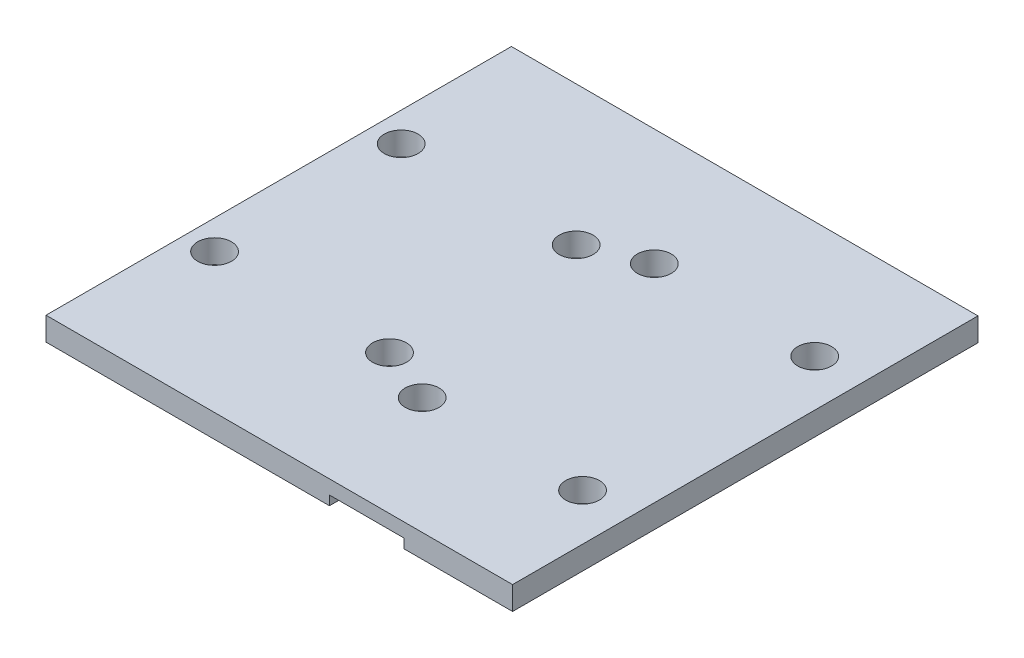
ISO-10303-21;
HEADER;
FILE_DESCRIPTION(('STEP AP214'),'2;1');
FILE_NAME('part.step','',(''),(''),'','','');
FILE_SCHEMA(('AUTOMOTIVE_DESIGN { 1 0 10303 214 1 1 1 1 }'));
ENDSEC;
DATA;
#1=APPLICATION_CONTEXT('core data for automotive mechanical design processes');
#2=APPLICATION_PROTOCOL_DEFINITION('international standard','automotive_design',2000,#1);
#3=PRODUCT_CONTEXT('',#1,'mechanical');
#4=PRODUCT('Part','Part','',(#3));
#5=PRODUCT_RELATED_PRODUCT_CATEGORY('part','',(#4));
#6=PRODUCT_DEFINITION_FORMATION('','',#4);
#7=PRODUCT_DEFINITION_CONTEXT('part definition',#1,'design');
#8=PRODUCT_DEFINITION('design','',#6,#7);
#9=PRODUCT_DEFINITION_SHAPE('','',#8);
#10=(LENGTH_UNIT() NAMED_UNIT(*) SI_UNIT(.MILLI.,.METRE.));
#11=(NAMED_UNIT(*) PLANE_ANGLE_UNIT() SI_UNIT($,.RADIAN.));
#12=(NAMED_UNIT(*) SI_UNIT($,.STERADIAN.) SOLID_ANGLE_UNIT());
#13=UNCERTAINTY_MEASURE_WITH_UNIT(LENGTH_MEASURE(1.E-05),#10,'distance_accuracy_value','');
#14=(GEOMETRIC_REPRESENTATION_CONTEXT(3) GLOBAL_UNCERTAINTY_ASSIGNED_CONTEXT((#13)) GLOBAL_UNIT_ASSIGNED_CONTEXT((#10,
#11,#12)) REPRESENTATION_CONTEXT('',''));
#15=CARTESIAN_POINT('',(0.,0.,0.));
#16=DIRECTION('',(0.,0.,1.));
#17=DIRECTION('',(1.,0.,0.));
#18=AXIS2_PLACEMENT_3D('',#15,#16,#17);
#19=CARTESIAN_POINT('',(0.,0.,0.));
#20=DIRECTION('',(0.,-1.,0.));
#21=DIRECTION('',(0.,0.,-1.));
#22=AXIS2_PLACEMENT_3D('',#19,#20,#21);
#23=PLANE('',#22);
#24=DIRECTION('',(0.,0.,1.));
#25=VECTOR('',#24,1.);
#26=CARTESIAN_POINT('',(30.7,0.,0.));
#27=LINE('',#26,#25);
#28=CARTESIAN_POINT('',(30.7,0.,-39.9));
#29=VERTEX_POINT('',#28);
#30=CARTESIAN_POINT('',(30.7,0.,0.));
#31=VERTEX_POINT('',#30);
#32=EDGE_CURVE('E113',#29,#31,#27,.T.);
#33=ORIENTED_EDGE('',*,*,#32,.F.);
#34=DIRECTION('',(-1.,0.,0.));
#35=VECTOR('',#34,1.);
#36=CARTESIAN_POINT('',(0.,0.,-39.9));
#37=LINE('',#36,#35);
#38=CARTESIAN_POINT('',(40.,0.,-39.9));
#39=VERTEX_POINT('',#38);
#40=EDGE_CURVE('E192',#39,#29,#37,.T.);
#41=ORIENTED_EDGE('',*,*,#40,.F.);
#42=DIRECTION('',(0.,0.,-1.));
#43=VECTOR('',#42,1.);
#44=CARTESIAN_POINT('',(40.,0.,0.));
#45=LINE('',#44,#43);
#46=CARTESIAN_POINT('',(40.,0.,0.));
#47=VERTEX_POINT('',#46);
#48=EDGE_CURVE('E203',#47,#39,#45,.T.);
#49=ORIENTED_EDGE('',*,*,#48,.F.);
#50=DIRECTION('',(1.,0.,0.));
#51=VECTOR('',#50,1.);
#52=CARTESIAN_POINT('',(0.,0.,0.));
#53=LINE('',#52,#51);
#54=EDGE_CURVE('E200',#31,#47,#53,.T.);
#55=ORIENTED_EDGE('',*,*,#54,.F.);
#56=EDGE_LOOP('',(#33,#41,#49,#55));
#57=FACE_BOUND('',#56,.T.);
#58=CARTESIAN_POINT('',(36.,0.,-10.));
#59=DIRECTION('',(0.,-1.,0.));
#60=DIRECTION('',(0.,0.,-1.));
#61=AXIS2_PLACEMENT_3D('',#58,#59,#60);
#62=CIRCLE('',#61,1.45);
#63=CARTESIAN_POINT('',(36.,0.,-11.45));
#64=VERTEX_POINT('',#63);
#65=EDGE_CURVE('E142',#64,#64,#62,.T.);
#66=ORIENTED_EDGE('',*,*,#65,.F.);
#67=EDGE_LOOP('',(#66));
#68=FACE_BOUND('',#67,.T.);
#69=CARTESIAN_POINT('',(36.,0.,-29.8999999999996));
#70=DIRECTION('',(0.,-1.,0.));
#71=DIRECTION('',(0.,0.,1.));
#72=AXIS2_PLACEMENT_3D('',#69,#70,#71);
#73=CIRCLE('',#72,1.45);
#74=CARTESIAN_POINT('',(36.,0.,-28.4499999999996));
#75=VERTEX_POINT('',#74);
#76=EDGE_CURVE('E150',#75,#75,#73,.T.);
#77=ORIENTED_EDGE('',*,*,#76,.F.);
#78=EDGE_LOOP('',(#77));
#79=FACE_BOUND('',#78,.T.);
#80=ADVANCED_FACE('F34',(#57,#68,#79),#23,.T.);
#81=CARTESIAN_POINT('',(0.,2.,0.));
#82=DIRECTION('',(1.,0.,0.));
#83=DIRECTION('',(0.,0.,-1.));
#84=AXIS2_PLACEMENT_3D('',#81,#82,#83);
#85=PLANE('',#84);
#86=DIRECTION('',(0.,0.,1.));
#87=VECTOR('',#86,1.);
#88=CARTESIAN_POINT('',(0.,0.,0.));
#89=LINE('',#88,#87);
#90=CARTESIAN_POINT('',(0.,0.,-39.9));
#91=VERTEX_POINT('',#90);
#92=CARTESIAN_POINT('',(0.,0.,0.));
#93=VERTEX_POINT('',#92);
#94=EDGE_CURVE('E187',#91,#93,#89,.T.);
#95=ORIENTED_EDGE('',*,*,#94,.T.);
#96=DIRECTION('',(0.,-1.,0.));
#97=VECTOR('',#96,1.);
#98=CARTESIAN_POINT('',(0.,2.,0.));
#99=LINE('',#98,#97);
#100=CARTESIAN_POINT('',(0.,2.,0.));
#101=VERTEX_POINT('',#100);
#102=EDGE_CURVE('E11',#101,#93,#99,.T.);
#103=ORIENTED_EDGE('',*,*,#102,.F.);
#104=DIRECTION('',(0.,0.,1.));
#105=VECTOR('',#104,1.);
#106=CARTESIAN_POINT('',(0.,2.,0.));
#107=LINE('',#106,#105);
#108=CARTESIAN_POINT('',(0.,2.,-39.9));
#109=VERTEX_POINT('',#108);
#110=EDGE_CURVE('E190',#109,#101,#107,.T.);
#111=ORIENTED_EDGE('',*,*,#110,.F.);
#112=DIRECTION('',(0.,-1.,0.));
#113=VECTOR('',#112,1.);
#114=CARTESIAN_POINT('',(0.,2.,-39.9));
#115=LINE('',#114,#113);
#116=EDGE_CURVE('E197',#109,#91,#115,.T.);
#117=ORIENTED_EDGE('',*,*,#116,.T.);
#118=EDGE_LOOP('',(#95,#103,#111,#117));
#119=FACE_BOUND('',#118,.T.);
#120=ADVANCED_FACE('F36',(#119),#85,.F.);
#121=CARTESIAN_POINT('',(0.,2.,0.));
#122=DIRECTION('',(0.,0.,-1.));
#123=DIRECTION('',(-1.,0.,0.));
#124=AXIS2_PLACEMENT_3D('',#121,#122,#123);
#125=PLANE('',#124);
#126=DIRECTION('',(-1.,0.,0.));
#127=VECTOR('',#126,1.);
#128=CARTESIAN_POINT('',(30.7,0.8,0.));
#129=LINE('',#128,#127);
#130=CARTESIAN_POINT('',(30.7,0.8,0.));
#131=VERTEX_POINT('',#130);
#132=CARTESIAN_POINT('',(24.3,0.8,0.));
#133=VERTEX_POINT('',#132);
#134=EDGE_CURVE('E122',#131,#133,#129,.T.);
#135=ORIENTED_EDGE('',*,*,#134,.F.);
#136=DIRECTION('',(0.,-1.,0.));
#137=VECTOR('',#136,1.);
#138=CARTESIAN_POINT('',(30.7,0.8,0.));
#139=LINE('',#138,#137);
#140=EDGE_CURVE('E107',#131,#31,#139,.T.);
#141=ORIENTED_EDGE('',*,*,#140,.T.);
#142=ORIENTED_EDGE('',*,*,#54,.T.);
#143=DIRECTION('',(0.,-1.,0.));
#144=VECTOR('',#143,1.);
#145=CARTESIAN_POINT('',(40.,2.,0.));
#146=LINE('',#145,#144);
#147=CARTESIAN_POINT('',(40.,2.,0.));
#148=VERTEX_POINT('',#147);
#149=EDGE_CURVE('E42',#148,#47,#146,.T.);
#150=ORIENTED_EDGE('',*,*,#149,.F.);
#151=DIRECTION('',(1.,0.,0.));
#152=VECTOR('',#151,1.);
#153=CARTESIAN_POINT('',(0.,2.,0.));
#154=LINE('',#153,#152);
#155=EDGE_CURVE('E86',#101,#148,#154,.T.);
#156=ORIENTED_EDGE('',*,*,#155,.F.);
#157=ORIENTED_EDGE('',*,*,#102,.T.);
#158=CARTESIAN_POINT('',(24.3,0.,0.));
#159=VERTEX_POINT('',#158);
#160=EDGE_CURVE('E201',#93,#159,#53,.T.);
#161=ORIENTED_EDGE('',*,*,#160,.T.);
#162=DIRECTION('',(0.,-1.,0.));
#163=VECTOR('',#162,1.);
#164=CARTESIAN_POINT('',(24.3,0.8,0.));
#165=LINE('',#164,#163);
#166=EDGE_CURVE('E49',#133,#159,#165,.T.);
#167=ORIENTED_EDGE('',*,*,#166,.F.);
#168=EDGE_LOOP('',(#135,#141,#142,#150,#156,#157,#161,#167));
#169=FACE_BOUND('',#168,.T.);
#170=ADVANCED_FACE('F127',(#169),#125,.F.);
#171=CARTESIAN_POINT('',(40.,2.,0.));
#172=DIRECTION('',(-1.,0.,0.));
#173=DIRECTION('',(0.,0.,1.));
#174=AXIS2_PLACEMENT_3D('',#171,#172,#173);
#175=PLANE('',#174);
#176=ORIENTED_EDGE('',*,*,#48,.T.);
#177=DIRECTION('',(0.,-1.,0.));
#178=VECTOR('',#177,1.);
#179=CARTESIAN_POINT('',(40.,2.,-39.9));
#180=LINE('',#179,#178);
#181=CARTESIAN_POINT('',(40.,2.,-39.9));
#182=VERTEX_POINT('',#181);
#183=EDGE_CURVE('E208',#182,#39,#180,.T.);
#184=ORIENTED_EDGE('',*,*,#183,.F.);
#185=DIRECTION('',(0.,0.,-1.));
#186=VECTOR('',#185,1.);
#187=CARTESIAN_POINT('',(40.,2.,0.));
#188=LINE('',#187,#186);
#189=EDGE_CURVE('E194',#148,#182,#188,.T.);
#190=ORIENTED_EDGE('',*,*,#189,.F.);
#191=ORIENTED_EDGE('',*,*,#149,.T.);
#192=EDGE_LOOP('',(#176,#184,#190,#191));
#193=FACE_BOUND('',#192,.T.);
#194=ADVANCED_FACE('F214',(#193),#175,.F.);
#195=CARTESIAN_POINT('',(0.,2.,-39.9));
#196=DIRECTION('',(0.,0.,1.));
#197=DIRECTION('',(1.,0.,0.));
#198=AXIS2_PLACEMENT_3D('',#195,#196,#197);
#199=PLANE('',#198);
#200=ORIENTED_EDGE('',*,*,#40,.T.);
#201=DIRECTION('',(0.,-1.,0.));
#202=VECTOR('',#201,1.);
#203=CARTESIAN_POINT('',(30.7,0.8,-39.9));
#204=LINE('',#203,#202);
#205=CARTESIAN_POINT('',(30.7,0.8,-39.9));
#206=VERTEX_POINT('',#205);
#207=EDGE_CURVE('E136',#206,#29,#204,.T.);
#208=ORIENTED_EDGE('',*,*,#207,.F.);
#209=DIRECTION('',(1.,0.,0.));
#210=VECTOR('',#209,1.);
#211=CARTESIAN_POINT('',(30.7,0.8,-39.9));
#212=LINE('',#211,#210);
#213=CARTESIAN_POINT('',(24.3,0.8,-39.9));
#214=VERTEX_POINT('',#213);
#215=EDGE_CURVE('E116',#214,#206,#212,.T.);
#216=ORIENTED_EDGE('',*,*,#215,.F.);
#217=DIRECTION('',(0.,-1.,0.));
#218=VECTOR('',#217,1.);
#219=CARTESIAN_POINT('',(24.3,0.8,-39.9));
#220=LINE('',#219,#218);
#221=CARTESIAN_POINT('',(24.3,0.,-39.9));
#222=VERTEX_POINT('',#221);
#223=EDGE_CURVE('E139',#214,#222,#220,.T.);
#224=ORIENTED_EDGE('',*,*,#223,.T.);
#225=EDGE_CURVE('E79',#222,#91,#37,.T.);
#226=ORIENTED_EDGE('',*,*,#225,.T.);
#227=ORIENTED_EDGE('',*,*,#116,.F.);
#228=DIRECTION('',(-1.,0.,0.));
#229=VECTOR('',#228,1.);
#230=CARTESIAN_POINT('',(0.,2.,-39.9));
#231=LINE('',#230,#229);
#232=EDGE_CURVE('E58',#182,#109,#231,.T.);
#233=ORIENTED_EDGE('',*,*,#232,.F.);
#234=ORIENTED_EDGE('',*,*,#183,.T.);
#235=EDGE_LOOP('',(#200,#208,#216,#224,#226,#227,#233,#234));
#236=FACE_BOUND('',#235,.T.);
#237=ADVANCED_FACE('F219',(#236),#199,.F.);
#238=CARTESIAN_POINT('',(0.,2.,0.));
#239=DIRECTION('',(0.,-1.,0.));
#240=DIRECTION('',(0.,0.,-1.));
#241=AXIS2_PLACEMENT_3D('',#238,#239,#240);
#242=PLANE('',#241);
#243=CARTESIAN_POINT('',(22.25,2.,-29.8999999999996));
#244=DIRECTION('',(0.,-1.,0.));
#245=DIRECTION('',(0.,0.,-1.));
#246=AXIS2_PLACEMENT_3D('',#243,#244,#245);
#247=CIRCLE('',#246,1.45);
#248=CARTESIAN_POINT('',(22.25,2.,-31.3499999999996));
#249=VERTEX_POINT('',#248);
#250=EDGE_CURVE('E153',#249,#249,#247,.F.);
#251=ORIENTED_EDGE('',*,*,#250,.F.);
#252=EDGE_LOOP('',(#251));
#253=FACE_BOUND('',#252,.T.);
#254=CARTESIAN_POINT('',(36.,2.,-29.8999999999996));
#255=DIRECTION('',(0.,-1.,0.));
#256=DIRECTION('',(0.,0.,-1.));
#257=AXIS2_PLACEMENT_3D('',#254,#255,#256);
#258=CIRCLE('',#257,1.45);
#259=CARTESIAN_POINT('',(36.,2.,-31.3499999999996));
#260=VERTEX_POINT('',#259);
#261=EDGE_CURVE('E146',#260,#260,#258,.F.);
#262=ORIENTED_EDGE('',*,*,#261,.F.);
#263=EDGE_LOOP('',(#262));
#264=FACE_BOUND('',#263,.T.);
#265=CARTESIAN_POINT('',(36.,2.,-10.));
#266=DIRECTION('',(0.,-1.,0.));
#267=DIRECTION('',(0.,0.,-1.));
#268=AXIS2_PLACEMENT_3D('',#265,#266,#267);
#269=CIRCLE('',#268,1.45);
#270=CARTESIAN_POINT('',(36.,2.,-11.45));
#271=VERTEX_POINT('',#270);
#272=EDGE_CURVE('E145',#271,#271,#269,.F.);
#273=ORIENTED_EDGE('',*,*,#272,.F.);
#274=EDGE_LOOP('',(#273));
#275=FACE_BOUND('',#274,.T.);
#276=CARTESIAN_POINT('',(22.25,2.,-10.));
#277=DIRECTION('',(0.,-1.,0.));
#278=DIRECTION('',(0.,0.,-1.));
#279=AXIS2_PLACEMENT_3D('',#276,#277,#278);
#280=CIRCLE('',#279,1.45);
#281=CARTESIAN_POINT('',(22.25,2.,-11.45));
#282=VERTEX_POINT('',#281);
#283=EDGE_CURVE('E162',#282,#282,#280,.F.);
#284=ORIENTED_EDGE('',*,*,#283,.F.);
#285=EDGE_LOOP('',(#284));
#286=FACE_BOUND('',#285,.T.);
#287=CARTESIAN_POINT('',(2.5,2.,-27.95));
#288=DIRECTION('',(0.,1.,0.));
#289=DIRECTION('',(0.,0.,1.));
#290=AXIS2_PLACEMENT_3D('',#287,#288,#289);
#291=CIRCLE('',#290,1.45);
#292=CARTESIAN_POINT('',(2.5,2.,-26.5));
#293=VERTEX_POINT('',#292);
#294=EDGE_CURVE('E165',#293,#293,#291,.T.);
#295=ORIENTED_EDGE('',*,*,#294,.F.);
#296=EDGE_LOOP('',(#295));
#297=FACE_BOUND('',#296,.T.);
#298=CARTESIAN_POINT('',(17.5,2.,-27.95));
#299=DIRECTION('',(0.,1.,0.));
#300=DIRECTION('',(0.,0.,1.));
#301=AXIS2_PLACEMENT_3D('',#298,#299,#300);
#302=CIRCLE('',#301,1.45);
#303=CARTESIAN_POINT('',(17.5,2.,-26.5));
#304=VERTEX_POINT('',#303);
#305=EDGE_CURVE('E176',#304,#304,#302,.T.);
#306=ORIENTED_EDGE('',*,*,#305,.F.);
#307=EDGE_LOOP('',(#306));
#308=FACE_BOUND('',#307,.T.);
#309=CARTESIAN_POINT('',(17.5,2.,-11.95));
#310=DIRECTION('',(0.,1.,0.));
#311=DIRECTION('',(0.,0.,1.));
#312=AXIS2_PLACEMENT_3D('',#309,#310,#311);
#313=CIRCLE('',#312,1.45);
#314=CARTESIAN_POINT('',(17.5,2.,-10.5));
#315=VERTEX_POINT('',#314);
#316=EDGE_CURVE('E170',#315,#315,#313,.T.);
#317=ORIENTED_EDGE('',*,*,#316,.F.);
#318=EDGE_LOOP('',(#317));
#319=FACE_BOUND('',#318,.T.);
#320=CARTESIAN_POINT('',(2.5,2.,-11.95));
#321=DIRECTION('',(0.,1.,0.));
#322=DIRECTION('',(0.,0.,1.));
#323=AXIS2_PLACEMENT_3D('',#320,#321,#322);
#324=CIRCLE('',#323,1.45);
#325=CARTESIAN_POINT('',(2.5,2.,-10.5));
#326=VERTEX_POINT('',#325);
#327=EDGE_CURVE('E169',#326,#326,#324,.T.);
#328=ORIENTED_EDGE('',*,*,#327,.F.);
#329=EDGE_LOOP('',(#328));
#330=FACE_BOUND('',#329,.T.);
#331=ORIENTED_EDGE('',*,*,#110,.T.);
#332=ORIENTED_EDGE('',*,*,#155,.T.);
#333=ORIENTED_EDGE('',*,*,#189,.T.);
#334=ORIENTED_EDGE('',*,*,#232,.T.);
#335=EDGE_LOOP('',(#331,#332,#333,#334));
#336=FACE_BOUND('',#335,.T.);
#337=ADVANCED_FACE('F224',(#253,#264,#275,#286,#297,#308,#319,#330,#336),#242,.F.);
#338=DIRECTION('',(0.,0.,-1.));
#339=VECTOR('',#338,1.);
#340=CARTESIAN_POINT('',(24.3,0.,0.));
#341=LINE('',#340,#339);
#342=EDGE_CURVE('E125',#159,#222,#341,.T.);
#343=ORIENTED_EDGE('',*,*,#342,.F.);
#344=ORIENTED_EDGE('',*,*,#160,.F.);
#345=ORIENTED_EDGE('',*,*,#94,.F.);
#346=ORIENTED_EDGE('',*,*,#225,.F.);
#347=EDGE_LOOP('',(#343,#344,#345,#346));
#348=FACE_BOUND('',#347,.T.);
#349=CARTESIAN_POINT('',(22.25,0.,-29.8999999999996));
#350=DIRECTION('',(0.,-1.,0.));
#351=DIRECTION('',(0.,0.,1.));
#352=AXIS2_PLACEMENT_3D('',#349,#350,#351);
#353=CIRCLE('',#352,1.45);
#354=CARTESIAN_POINT('',(22.25,0.,-28.4499999999996));
#355=VERTEX_POINT('',#354);
#356=EDGE_CURVE('E138',#355,#355,#353,.T.);
#357=ORIENTED_EDGE('',*,*,#356,.F.);
#358=EDGE_LOOP('',(#357));
#359=FACE_BOUND('',#358,.T.);
#360=CARTESIAN_POINT('',(22.25,0.,-10.));
#361=DIRECTION('',(0.,-1.,0.));
#362=DIRECTION('',(0.,0.,-1.));
#363=AXIS2_PLACEMENT_3D('',#360,#361,#362);
#364=CIRCLE('',#363,1.45);
#365=CARTESIAN_POINT('',(22.25,0.,-11.45));
#366=VERTEX_POINT('',#365);
#367=EDGE_CURVE('E149',#366,#366,#364,.T.);
#368=ORIENTED_EDGE('',*,*,#367,.F.);
#369=EDGE_LOOP('',(#368));
#370=FACE_BOUND('',#369,.T.);
#371=CARTESIAN_POINT('',(2.5,0.,-27.95));
#372=DIRECTION('',(0.,1.,0.));
#373=DIRECTION('',(0.,0.,1.));
#374=AXIS2_PLACEMENT_3D('',#371,#372,#373);
#375=CIRCLE('',#374,1.45);
#376=CARTESIAN_POINT('',(2.5,0.,-26.5));
#377=VERTEX_POINT('',#376);
#378=EDGE_CURVE('E179',#377,#377,#375,.T.);
#379=ORIENTED_EDGE('',*,*,#378,.T.);
#380=EDGE_LOOP('',(#379));
#381=FACE_BOUND('',#380,.T.);
#382=CARTESIAN_POINT('',(17.5,0.,-27.95));
#383=DIRECTION('',(0.,1.,0.));
#384=DIRECTION('',(0.,0.,1.));
#385=AXIS2_PLACEMENT_3D('',#382,#383,#384);
#386=CIRCLE('',#385,1.45);
#387=CARTESIAN_POINT('',(17.5,0.,-26.5));
#388=VERTEX_POINT('',#387);
#389=EDGE_CURVE('E173',#388,#388,#386,.T.);
#390=ORIENTED_EDGE('',*,*,#389,.T.);
#391=EDGE_LOOP('',(#390));
#392=FACE_BOUND('',#391,.T.);
#393=CARTESIAN_POINT('',(17.5,0.,-11.95));
#394=DIRECTION('',(0.,1.,0.));
#395=DIRECTION('',(0.,0.,1.));
#396=AXIS2_PLACEMENT_3D('',#393,#394,#395);
#397=CIRCLE('',#396,1.45);
#398=CARTESIAN_POINT('',(17.5,0.,-10.5));
#399=VERTEX_POINT('',#398);
#400=EDGE_CURVE('E166',#399,#399,#397,.T.);
#401=ORIENTED_EDGE('',*,*,#400,.T.);
#402=EDGE_LOOP('',(#401));
#403=FACE_BOUND('',#402,.T.);
#404=CARTESIAN_POINT('',(2.5,0.,-11.95));
#405=DIRECTION('',(0.,1.,0.));
#406=DIRECTION('',(0.,0.,1.));
#407=AXIS2_PLACEMENT_3D('',#404,#405,#406);
#408=CIRCLE('',#407,1.45);
#409=CARTESIAN_POINT('',(2.5,0.,-10.5));
#410=VERTEX_POINT('',#409);
#411=EDGE_CURVE('E184',#410,#410,#408,.T.);
#412=ORIENTED_EDGE('',*,*,#411,.T.);
#413=EDGE_LOOP('',(#412));
#414=FACE_BOUND('',#413,.T.);
#415=ADVANCED_FACE('F226',(#348,#359,#370,#381,#392,#403,#414),#23,.T.);
#416=CARTESIAN_POINT('',(2.5,0.,-11.95));
#417=DIRECTION('',(0.,1.,0.));
#418=DIRECTION('',(0.,0.,1.));
#419=AXIS2_PLACEMENT_3D('',#416,#417,#418);
#420=CYLINDRICAL_SURFACE('',#419,1.45);
#421=ORIENTED_EDGE('',*,*,#411,.F.);
#422=EDGE_LOOP('',(#421));
#423=FACE_BOUND('',#422,.T.);
#424=ORIENTED_EDGE('',*,*,#327,.T.);
#425=EDGE_LOOP('',(#424));
#426=FACE_BOUND('',#425,.T.);
#427=ADVANCED_FACE('F233',(#423,#426),#420,.F.);
#428=CARTESIAN_POINT('',(17.5,0.,-11.95));
#429=DIRECTION('',(0.,1.,0.));
#430=DIRECTION('',(0.,0.,1.));
#431=AXIS2_PLACEMENT_3D('',#428,#429,#430);
#432=CYLINDRICAL_SURFACE('',#431,1.45);
#433=ORIENTED_EDGE('',*,*,#400,.F.);
#434=EDGE_LOOP('',(#433));
#435=FACE_BOUND('',#434,.T.);
#436=ORIENTED_EDGE('',*,*,#316,.T.);
#437=EDGE_LOOP('',(#436));
#438=FACE_BOUND('',#437,.T.);
#439=ADVANCED_FACE('F317',(#435,#438),#432,.F.);
#440=CARTESIAN_POINT('',(17.5,0.,-27.95));
#441=DIRECTION('',(0.,1.,0.));
#442=DIRECTION('',(0.,0.,1.));
#443=AXIS2_PLACEMENT_3D('',#440,#441,#442);
#444=CYLINDRICAL_SURFACE('',#443,1.45);
#445=ORIENTED_EDGE('',*,*,#389,.F.);
#446=EDGE_LOOP('',(#445));
#447=FACE_BOUND('',#446,.T.);
#448=ORIENTED_EDGE('',*,*,#305,.T.);
#449=EDGE_LOOP('',(#448));
#450=FACE_BOUND('',#449,.T.);
#451=ADVANCED_FACE('F320',(#447,#450),#444,.F.);
#452=CARTESIAN_POINT('',(2.5,0.,-27.95));
#453=DIRECTION('',(0.,1.,0.));
#454=DIRECTION('',(0.,0.,1.));
#455=AXIS2_PLACEMENT_3D('',#452,#453,#454);
#456=CYLINDRICAL_SURFACE('',#455,1.45);
#457=ORIENTED_EDGE('',*,*,#378,.F.);
#458=EDGE_LOOP('',(#457));
#459=FACE_BOUND('',#458,.T.);
#460=ORIENTED_EDGE('',*,*,#294,.T.);
#461=EDGE_LOOP('',(#460));
#462=FACE_BOUND('',#461,.T.);
#463=ADVANCED_FACE('F315',(#459,#462),#456,.F.);
#464=CARTESIAN_POINT('',(22.25,2.001,-10.));
#465=DIRECTION('',(0.,-1.,0.));
#466=DIRECTION('',(0.,0.,-1.));
#467=AXIS2_PLACEMENT_3D('',#464,#465,#466);
#468=CYLINDRICAL_SURFACE('',#467,1.45);
#469=ORIENTED_EDGE('',*,*,#367,.T.);
#470=EDGE_LOOP('',(#469));
#471=FACE_BOUND('',#470,.T.);
#472=ORIENTED_EDGE('',*,*,#283,.T.);
#473=EDGE_LOOP('',(#472));
#474=FACE_BOUND('',#473,.T.);
#475=ADVANCED_FACE('F306',(#471,#474),#468,.F.);
#476=CARTESIAN_POINT('',(36.,2.001,-10.));
#477=DIRECTION('',(0.,-1.,0.));
#478=DIRECTION('',(0.,0.,-1.));
#479=AXIS2_PLACEMENT_3D('',#476,#477,#478);
#480=CYLINDRICAL_SURFACE('',#479,1.45);
#481=ORIENTED_EDGE('',*,*,#65,.T.);
#482=EDGE_LOOP('',(#481));
#483=FACE_BOUND('',#482,.T.);
#484=ORIENTED_EDGE('',*,*,#272,.T.);
#485=EDGE_LOOP('',(#484));
#486=FACE_BOUND('',#485,.T.);
#487=ADVANCED_FACE('F302',(#483,#486),#480,.F.);
#488=CARTESIAN_POINT('',(36.,2.001,-29.8999999999996));
#489=DIRECTION('',(0.,-1.,0.));
#490=DIRECTION('',(0.,0.,-1.));
#491=AXIS2_PLACEMENT_3D('',#488,#489,#490);
#492=CYLINDRICAL_SURFACE('',#491,1.45);
#493=ORIENTED_EDGE('',*,*,#76,.T.);
#494=EDGE_LOOP('',(#493));
#495=FACE_BOUND('',#494,.T.);
#496=ORIENTED_EDGE('',*,*,#261,.T.);
#497=EDGE_LOOP('',(#496));
#498=FACE_BOUND('',#497,.T.);
#499=ADVANCED_FACE('F305',(#495,#498),#492,.F.);
#500=CARTESIAN_POINT('',(22.25,2.001,-29.8999999999996));
#501=DIRECTION('',(0.,-1.,0.));
#502=DIRECTION('',(0.,0.,-1.));
#503=AXIS2_PLACEMENT_3D('',#500,#501,#502);
#504=CYLINDRICAL_SURFACE('',#503,1.45);
#505=ORIENTED_EDGE('',*,*,#356,.T.);
#506=EDGE_LOOP('',(#505));
#507=FACE_BOUND('',#506,.T.);
#508=ORIENTED_EDGE('',*,*,#250,.T.);
#509=EDGE_LOOP('',(#508));
#510=FACE_BOUND('',#509,.T.);
#511=ADVANCED_FACE('F279',(#507,#510),#504,.F.);
#512=CARTESIAN_POINT('',(30.7,0.8,0.));
#513=DIRECTION('',(1.,0.,0.));
#514=DIRECTION('',(0.,0.,-1.));
#515=AXIS2_PLACEMENT_3D('',#512,#513,#514);
#516=PLANE('',#515);
#517=ORIENTED_EDGE('',*,*,#32,.T.);
#518=ORIENTED_EDGE('',*,*,#140,.F.);
#519=DIRECTION('',(0.,0.,1.));
#520=VECTOR('',#519,1.);
#521=CARTESIAN_POINT('',(30.7,0.8,0.));
#522=LINE('',#521,#520);
#523=EDGE_CURVE('E110',#206,#131,#522,.T.);
#524=ORIENTED_EDGE('',*,*,#523,.F.);
#525=ORIENTED_EDGE('',*,*,#207,.T.);
#526=EDGE_LOOP('',(#517,#518,#524,#525));
#527=FACE_BOUND('',#526,.T.);
#528=ADVANCED_FACE('F109',(#527),#516,.F.);
#529=CARTESIAN_POINT('',(24.3,0.8,0.));
#530=DIRECTION('',(-1.,0.,0.));
#531=DIRECTION('',(0.,0.,1.));
#532=AXIS2_PLACEMENT_3D('',#529,#530,#531);
#533=PLANE('',#532);
#534=ORIENTED_EDGE('',*,*,#342,.T.);
#535=ORIENTED_EDGE('',*,*,#223,.F.);
#536=DIRECTION('',(0.,0.,-1.));
#537=VECTOR('',#536,1.);
#538=CARTESIAN_POINT('',(24.3,0.8,0.));
#539=LINE('',#538,#537);
#540=EDGE_CURVE('E129',#133,#214,#539,.T.);
#541=ORIENTED_EDGE('',*,*,#540,.F.);
#542=ORIENTED_EDGE('',*,*,#166,.T.);
#543=EDGE_LOOP('',(#534,#535,#541,#542));
#544=FACE_BOUND('',#543,.T.);
#545=ADVANCED_FACE('F278',(#544),#533,.F.);
#546=CARTESIAN_POINT('',(0.,0.8,0.));
#547=DIRECTION('',(0.,1.,0.));
#548=DIRECTION('',(0.,0.,1.));
#549=AXIS2_PLACEMENT_3D('',#546,#547,#548);
#550=PLANE('',#549);
#551=ORIENTED_EDGE('',*,*,#523,.T.);
#552=ORIENTED_EDGE('',*,*,#134,.T.);
#553=ORIENTED_EDGE('',*,*,#540,.T.);
#554=ORIENTED_EDGE('',*,*,#215,.T.);
#555=EDGE_LOOP('',(#551,#552,#553,#554));
#556=FACE_BOUND('',#555,.T.);
#557=ADVANCED_FACE('F120',(#556),#550,.F.);
#558=CLOSED_SHELL('',(#80,#120,#170,#194,#237,#337,#415,#427,#439,#451,#463,#475,#487,#499,#511,
#528,#545,#557));
#559=MANIFOLD_SOLID_BREP('B2',#558);
#560=ADVANCED_BREP_SHAPE_REPRESENTATION('',(#18,#559),#14);
#561=SHAPE_DEFINITION_REPRESENTATION(#9,#560);
ENDSEC;
END-ISO-10303-21;
